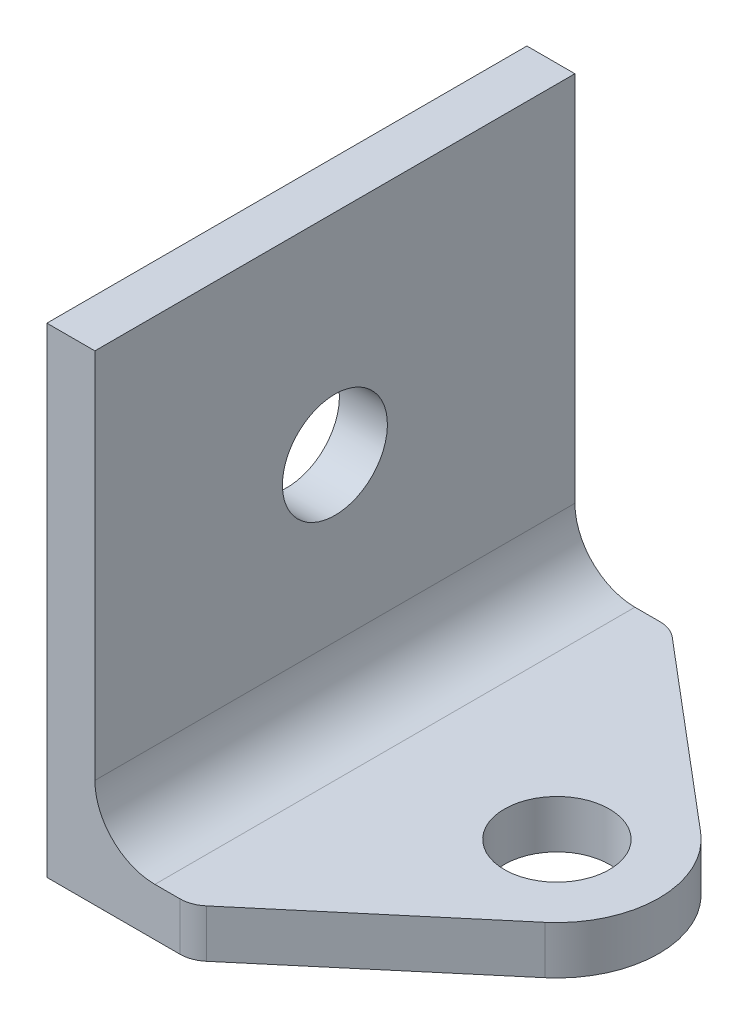
ISO-10303-21;
HEADER;
FILE_DESCRIPTION(('STEP AP214'),'2;1');
FILE_NAME('part.step','',(''),(''),'','','');
FILE_SCHEMA(('AUTOMOTIVE_DESIGN { 1 0 10303 214 1 1 1 1 }'));
ENDSEC;
DATA;
#1=APPLICATION_CONTEXT('core data for automotive mechanical design processes');
#2=APPLICATION_PROTOCOL_DEFINITION('international standard','automotive_design',2000,#1);
#3=PRODUCT_CONTEXT('',#1,'mechanical');
#4=PRODUCT('Part','Part','',(#3));
#5=PRODUCT_RELATED_PRODUCT_CATEGORY('part','',(#4));
#6=PRODUCT_DEFINITION_FORMATION('','',#4);
#7=PRODUCT_DEFINITION_CONTEXT('part definition',#1,'design');
#8=PRODUCT_DEFINITION('design','',#6,#7);
#9=PRODUCT_DEFINITION_SHAPE('','',#8);
#10=(LENGTH_UNIT() NAMED_UNIT(*) SI_UNIT(.MILLI.,.METRE.));
#11=(NAMED_UNIT(*) PLANE_ANGLE_UNIT() SI_UNIT($,.RADIAN.));
#12=(NAMED_UNIT(*) SI_UNIT($,.STERADIAN.) SOLID_ANGLE_UNIT());
#13=UNCERTAINTY_MEASURE_WITH_UNIT(LENGTH_MEASURE(1.E-05),#10,'distance_accuracy_value','');
#14=(GEOMETRIC_REPRESENTATION_CONTEXT(3) GLOBAL_UNCERTAINTY_ASSIGNED_CONTEXT((#13)) GLOBAL_UNIT_ASSIGNED_CONTEXT((#10,
#11,#12)) REPRESENTATION_CONTEXT('',''));
#15=CARTESIAN_POINT('',(0.,0.,0.));
#16=DIRECTION('',(0.,0.,1.));
#17=DIRECTION('',(1.,0.,0.));
#18=AXIS2_PLACEMENT_3D('',#15,#16,#17);
#19=CARTESIAN_POINT('',(0.,80.,40.));
#20=DIRECTION('',(1.,0.,0.));
#21=DIRECTION('',(0.,1.,0.));
#22=AXIS2_PLACEMENT_3D('',#19,#20,#21);
#23=PLANE('',#22);
#24=CARTESIAN_POINT('',(0.,45.,0.));
#25=DIRECTION('',(1.,0.,0.));
#26=DIRECTION('',(0.,1.,0.));
#27=AXIS2_PLACEMENT_3D('',#24,#25,#26);
#28=CIRCLE('',#27,8.75);
#29=CARTESIAN_POINT('',(0.,53.75,0.));
#30=VERTEX_POINT('',#29);
#31=EDGE_CURVE('E169',#30,#30,#28,.T.);
#32=ORIENTED_EDGE('',*,*,#31,.T.);
#33=EDGE_LOOP('',(#32));
#34=FACE_BOUND('',#33,.T.);
#35=DIRECTION('',(0.,-1.,0.));
#36=VECTOR('',#35,1.);
#37=CARTESIAN_POINT('',(0.,80.,-40.));
#38=LINE('',#37,#36);
#39=CARTESIAN_POINT('',(0.,80.,-40.));
#40=VERTEX_POINT('',#39);
#41=CARTESIAN_POINT('',(0.,0.,-40.));
#42=VERTEX_POINT('',#41);
#43=EDGE_CURVE('E181',#40,#42,#38,.T.);
#44=ORIENTED_EDGE('',*,*,#43,.T.);
#45=DIRECTION('',(0.,0.,-1.));
#46=VECTOR('',#45,1.);
#47=CARTESIAN_POINT('',(0.,0.,40.));
#48=LINE('',#47,#46);
#49=CARTESIAN_POINT('',(0.,0.,40.));
#50=VERTEX_POINT('',#49);
#51=EDGE_CURVE('E238',#50,#42,#48,.T.);
#52=ORIENTED_EDGE('',*,*,#51,.F.);
#53=DIRECTION('',(0.,-1.,0.));
#54=VECTOR('',#53,1.);
#55=CARTESIAN_POINT('',(0.,80.,40.));
#56=LINE('',#55,#54);
#57=CARTESIAN_POINT('',(0.,80.,40.));
#58=VERTEX_POINT('',#57);
#59=EDGE_CURVE('E185',#58,#50,#56,.T.);
#60=ORIENTED_EDGE('',*,*,#59,.F.);
#61=DIRECTION('',(0.,0.,-1.));
#62=VECTOR('',#61,1.);
#63=CARTESIAN_POINT('',(0.,80.,40.));
#64=LINE('',#63,#62);
#65=EDGE_CURVE('E205',#58,#40,#64,.T.);
#66=ORIENTED_EDGE('',*,*,#65,.T.);
#67=EDGE_LOOP('',(#44,#52,#60,#66));
#68=FACE_BOUND('',#67,.T.);
#69=ADVANCED_FACE('F44',(#34,#68),#23,.F.);
#70=CARTESIAN_POINT('',(0.,0.,40.));
#71=DIRECTION('',(0.,1.,0.));
#72=DIRECTION('',(0.,0.,1.));
#73=AXIS2_PLACEMENT_3D('',#70,#71,#72);
#74=PLANE('',#73);
#75=CARTESIAN_POINT('',(45.,0.,0.));
#76=DIRECTION('',(0.,1.,0.));
#77=DIRECTION('',(-1.,0.,0.));
#78=AXIS2_PLACEMENT_3D('',#75,#76,#77);
#79=CIRCLE('',#78,8.75);
#80=CARTESIAN_POINT('',(36.25,0.,0.));
#81=VERTEX_POINT('',#80);
#82=EDGE_CURVE('E177',#81,#81,#79,.T.);
#83=ORIENTED_EDGE('',*,*,#82,.T.);
#84=EDGE_LOOP('',(#83));
#85=FACE_BOUND('',#84,.T.);
#86=DIRECTION('',(1.,0.,0.));
#87=VECTOR('',#86,1.);
#88=CARTESIAN_POINT('',(0.,0.,-40.));
#89=LINE('',#88,#87);
#90=CARTESIAN_POINT('',(22.1704474497446,0.,-40.));
#91=VERTEX_POINT('',#90);
#92=EDGE_CURVE('E209',#42,#91,#89,.T.);
#93=ORIENTED_EDGE('',*,*,#92,.T.);
#94=CARTESIAN_POINT('',(22.1704474497446,0.,-35.));
#95=DIRECTION('',(0.,1.,0.));
#96=DIRECTION('',(0.,0.,1.));
#97=AXIS2_PLACEMENT_3D('',#94,#95,#96);
#98=CIRCLE('',#97,5.);
#99=CARTESIAN_POINT('',(25.3974831256792,0.,-38.8191937298657));
#100=VERTEX_POINT('',#99);
#101=EDGE_CURVE('E134',#91,#100,#98,.F.);
#102=ORIENTED_EDGE('',*,*,#101,.T.);
#103=DIRECTION('',(0.763838745973133,0.,0.645407135186923));
#104=VECTOR('',#103,1.);
#105=CARTESIAN_POINT('',(24.0000000000001,0.,-40.));
#106=LINE('',#105,#104);
#107=CARTESIAN_POINT('',(55.9719212981777,0.,-12.9852586815433));
#108=VERTEX_POINT('',#107);
#109=EDGE_CURVE('E127',#100,#108,#106,.T.);
#110=ORIENTED_EDGE('',*,*,#109,.T.);
#111=CARTESIAN_POINT('',(45.,0.,0.));
#112=DIRECTION('',(0.,-1.,0.));
#113=DIRECTION('',(-1.,0.,0.));
#114=AXIS2_PLACEMENT_3D('',#111,#112,#113);
#115=CIRCLE('',#114,17.);
#116=CARTESIAN_POINT('',(55.9719212981777,0.,12.9852586815433));
#117=VERTEX_POINT('',#116);
#118=EDGE_CURVE('E132',#108,#117,#115,.T.);
#119=ORIENTED_EDGE('',*,*,#118,.T.);
#120=DIRECTION('',(-0.763838745973134,0.,0.645407135186923));
#121=VECTOR('',#120,1.);
#122=CARTESIAN_POINT('',(24.0000000000001,0.,40.));
#123=LINE('',#122,#121);
#124=CARTESIAN_POINT('',(25.3974831256792,0.,38.8191937298657));
#125=VERTEX_POINT('',#124);
#126=EDGE_CURVE('E151',#117,#125,#123,.T.);
#127=ORIENTED_EDGE('',*,*,#126,.T.);
#128=CARTESIAN_POINT('',(22.1704474497446,0.,35.));
#129=DIRECTION('',(0.,1.,0.));
#130=DIRECTION('',(0.,0.,1.));
#131=AXIS2_PLACEMENT_3D('',#128,#129,#130);
#132=CIRCLE('',#131,5.);
#133=CARTESIAN_POINT('',(22.1704474497446,0.,40.));
#134=VERTEX_POINT('',#133);
#135=EDGE_CURVE('E60',#125,#134,#132,.F.);
#136=ORIENTED_EDGE('',*,*,#135,.T.);
#137=DIRECTION('',(1.,0.,0.));
#138=VECTOR('',#137,1.);
#139=CARTESIAN_POINT('',(0.,0.,40.));
#140=LINE('',#139,#138);
#141=EDGE_CURVE('E189',#50,#134,#140,.T.);
#142=ORIENTED_EDGE('',*,*,#141,.F.);
#143=ORIENTED_EDGE('',*,*,#51,.T.);
#144=EDGE_LOOP('',(#93,#102,#110,#119,#127,#136,#142,#143));
#145=FACE_BOUND('',#144,.T.);
#146=ADVANCED_FACE('F130',(#85,#145),#74,.F.);
#147=CARTESIAN_POINT('',(80.,8.,40.));
#148=DIRECTION('',(0.,-1.,0.));
#149=DIRECTION('',(1.,0.,0.));
#150=AXIS2_PLACEMENT_3D('',#147,#148,#149);
#151=PLANE('',#150);
#152=CARTESIAN_POINT('',(45.,8.,0.));
#153=DIRECTION('',(0.,1.,0.));
#154=DIRECTION('',(-1.,0.,0.));
#155=AXIS2_PLACEMENT_3D('',#152,#153,#154);
#156=CIRCLE('',#155,8.75);
#157=CARTESIAN_POINT('',(36.25,7.99999999999999,0.));
#158=VERTEX_POINT('',#157);
#159=EDGE_CURVE('E173',#158,#158,#156,.T.);
#160=ORIENTED_EDGE('',*,*,#159,.F.);
#161=EDGE_LOOP('',(#160));
#162=FACE_BOUND('',#161,.T.);
#163=DIRECTION('',(0.763838745973133,0.,0.645407135186923));
#164=VECTOR('',#163,1.);
#165=CARTESIAN_POINT('',(24.0000000000001,7.99999999999999,-40.));
#166=LINE('',#165,#164);
#167=CARTESIAN_POINT('',(25.3974831256792,7.99999999999999,-38.8191937298657));
#168=VERTEX_POINT('',#167);
#169=CARTESIAN_POINT('',(55.9719212981777,8.,-12.9852586815433));
#170=VERTEX_POINT('',#169);
#171=EDGE_CURVE('E145',#168,#170,#166,.T.);
#172=ORIENTED_EDGE('',*,*,#171,.F.);
#173=CARTESIAN_POINT('',(22.1704474497446,7.99999999999999,-35.));
#174=DIRECTION('',(0.,-1.,0.));
#175=DIRECTION('',(1.,0.,0.));
#176=AXIS2_PLACEMENT_3D('',#173,#174,#175);
#177=CIRCLE('',#176,5.);
#178=CARTESIAN_POINT('',(22.1704474497446,7.99999999999999,-40.));
#179=VERTEX_POINT('',#178);
#180=EDGE_CURVE('E248',#168,#179,#177,.F.);
#181=ORIENTED_EDGE('',*,*,#180,.T.);
#182=DIRECTION('',(-1.,0.,0.));
#183=VECTOR('',#182,1.);
#184=CARTESIAN_POINT('',(80.,8.,-40.));
#185=LINE('',#184,#183);
#186=CARTESIAN_POINT('',(18.0000000000001,7.99999999999999,-40.));
#187=VERTEX_POINT('',#186);
#188=EDGE_CURVE('E212',#179,#187,#185,.T.);
#189=ORIENTED_EDGE('',*,*,#188,.T.);
#190=DIRECTION('',(0.,0.,-1.));
#191=VECTOR('',#190,1.);
#192=CARTESIAN_POINT('',(18.0000000000001,7.99999999999999,40.));
#193=LINE('',#192,#191);
#194=CARTESIAN_POINT('',(18.0000000000001,7.99999999999999,40.));
#195=VERTEX_POINT('',#194);
#196=EDGE_CURVE('E234',#195,#187,#193,.T.);
#197=ORIENTED_EDGE('',*,*,#196,.F.);
#198=DIRECTION('',(-1.,0.,0.));
#199=VECTOR('',#198,1.);
#200=CARTESIAN_POINT('',(80.,8.,40.));
#201=LINE('',#200,#199);
#202=CARTESIAN_POINT('',(22.1704474497446,7.99999999999999,40.));
#203=VERTEX_POINT('',#202);
#204=EDGE_CURVE('E193',#203,#195,#201,.T.);
#205=ORIENTED_EDGE('',*,*,#204,.F.);
#206=CARTESIAN_POINT('',(22.1704474497446,7.99999999999999,35.));
#207=DIRECTION('',(0.,-1.,0.));
#208=DIRECTION('',(1.,0.,0.));
#209=AXIS2_PLACEMENT_3D('',#206,#207,#208);
#210=CIRCLE('',#209,5.);
#211=CARTESIAN_POINT('',(25.3974831256792,7.99999999999999,38.8191937298657));
#212=VERTEX_POINT('',#211);
#213=EDGE_CURVE('E245',#203,#212,#210,.F.);
#214=ORIENTED_EDGE('',*,*,#213,.T.);
#215=DIRECTION('',(-0.763838745973134,0.,0.645407135186923));
#216=VECTOR('',#215,1.);
#217=CARTESIAN_POINT('',(24.0000000000001,7.99999999999999,40.));
#218=LINE('',#217,#216);
#219=CARTESIAN_POINT('',(55.9719212981777,8.,12.9852586815433));
#220=VERTEX_POINT('',#219);
#221=EDGE_CURVE('E139',#220,#212,#218,.T.);
#222=ORIENTED_EDGE('',*,*,#221,.F.);
#223=CARTESIAN_POINT('',(45.,8.,0.));
#224=DIRECTION('',(0.,-1.,0.));
#225=DIRECTION('',(-1.,0.,0.));
#226=AXIS2_PLACEMENT_3D('',#223,#224,#225);
#227=CIRCLE('',#226,17.);
#228=EDGE_CURVE('E161',#170,#220,#227,.T.);
#229=ORIENTED_EDGE('',*,*,#228,.F.);
#230=EDGE_LOOP('',(#172,#181,#189,#197,#205,#214,#222,#229));
#231=FACE_BOUND('',#230,.T.);
#232=ADVANCED_FACE('F266',(#162,#231),#151,.F.);
#233=CARTESIAN_POINT('',(18.,18.,40.));
#234=DIRECTION('',(0.,0.,-1.));
#235=DIRECTION('',(-1.,0.,0.));
#236=AXIS2_PLACEMENT_3D('',#233,#234,#235);
#237=CYLINDRICAL_SURFACE('',#236,10.);
#238=CARTESIAN_POINT('',(18.,18.,-40.));
#239=DIRECTION('',(0.,0.,-1.));
#240=DIRECTION('',(-1.,0.,0.));
#241=AXIS2_PLACEMENT_3D('',#238,#239,#240);
#242=CIRCLE('',#241,10.);
#243=CARTESIAN_POINT('',(8.,18.,-40.));
#244=VERTEX_POINT('',#243);
#245=EDGE_CURVE('E215',#187,#244,#242,.T.);
#246=ORIENTED_EDGE('',*,*,#245,.T.);
#247=DIRECTION('',(0.,0.,-1.));
#248=VECTOR('',#247,1.);
#249=CARTESIAN_POINT('',(8.,18.,40.));
#250=LINE('',#249,#248);
#251=CARTESIAN_POINT('',(8.,18.,40.));
#252=VERTEX_POINT('',#251);
#253=EDGE_CURVE('E230',#252,#244,#250,.T.);
#254=ORIENTED_EDGE('',*,*,#253,.F.);
#255=CARTESIAN_POINT('',(18.,18.,40.));
#256=DIRECTION('',(0.,0.,-1.));
#257=DIRECTION('',(-1.,0.,0.));
#258=AXIS2_PLACEMENT_3D('',#255,#256,#257);
#259=CIRCLE('',#258,10.);
#260=EDGE_CURVE('E196',#195,#252,#259,.T.);
#261=ORIENTED_EDGE('',*,*,#260,.F.);
#262=ORIENTED_EDGE('',*,*,#196,.T.);
#263=EDGE_LOOP('',(#246,#254,#261,#262));
#264=FACE_BOUND('',#263,.T.);
#265=ADVANCED_FACE('F273',(#264),#237,.F.);
#266=CARTESIAN_POINT('',(7.99999999999999,18.0000000000001,40.));
#267=DIRECTION('',(-1.,0.,0.));
#268=DIRECTION('',(0.,-1.,0.));
#269=AXIS2_PLACEMENT_3D('',#266,#267,#268);
#270=PLANE('',#269);
#271=CARTESIAN_POINT('',(8.,45.,0.));
#272=DIRECTION('',(1.,0.,0.));
#273=DIRECTION('',(0.,1.,0.));
#274=AXIS2_PLACEMENT_3D('',#271,#272,#273);
#275=CIRCLE('',#274,8.75);
#276=CARTESIAN_POINT('',(8.,53.75,0.));
#277=VERTEX_POINT('',#276);
#278=EDGE_CURVE('E167',#277,#277,#275,.T.);
#279=ORIENTED_EDGE('',*,*,#278,.F.);
#280=EDGE_LOOP('',(#279));
#281=FACE_BOUND('',#280,.T.);
#282=DIRECTION('',(0.,1.,0.));
#283=VECTOR('',#282,1.);
#284=CARTESIAN_POINT('',(7.99999999999999,18.0000000000001,-40.));
#285=LINE('',#284,#283);
#286=CARTESIAN_POINT('',(8.,80.,-40.));
#287=VERTEX_POINT('',#286);
#288=EDGE_CURVE('E218',#244,#287,#285,.T.);
#289=ORIENTED_EDGE('',*,*,#288,.T.);
#290=DIRECTION('',(0.,0.,-1.));
#291=VECTOR('',#290,1.);
#292=CARTESIAN_POINT('',(8.,80.,40.));
#293=LINE('',#292,#291);
#294=CARTESIAN_POINT('',(8.,80.,40.));
#295=VERTEX_POINT('',#294);
#296=EDGE_CURVE('E226',#295,#287,#293,.T.);
#297=ORIENTED_EDGE('',*,*,#296,.F.);
#298=DIRECTION('',(0.,1.,0.));
#299=VECTOR('',#298,1.);
#300=CARTESIAN_POINT('',(7.99999999999999,18.0000000000001,40.));
#301=LINE('',#300,#299);
#302=EDGE_CURVE('E199',#252,#295,#301,.T.);
#303=ORIENTED_EDGE('',*,*,#302,.F.);
#304=ORIENTED_EDGE('',*,*,#253,.T.);
#305=EDGE_LOOP('',(#289,#297,#303,#304));
#306=FACE_BOUND('',#305,.T.);
#307=ADVANCED_FACE('F279',(#281,#306),#270,.F.);
#308=CARTESIAN_POINT('',(8.,80.,40.));
#309=DIRECTION('',(0.,-1.,0.));
#310=DIRECTION('',(0.,0.,-1.));
#311=AXIS2_PLACEMENT_3D('',#308,#309,#310);
#312=PLANE('',#311);
#313=DIRECTION('',(-1.,0.,0.));
#314=VECTOR('',#313,1.);
#315=CARTESIAN_POINT('',(8.,80.,-40.));
#316=LINE('',#315,#314);
#317=EDGE_CURVE('E190',#287,#40,#316,.T.);
#318=ORIENTED_EDGE('',*,*,#317,.T.);
#319=ORIENTED_EDGE('',*,*,#65,.F.);
#320=DIRECTION('',(-1.,0.,0.));
#321=VECTOR('',#320,1.);
#322=CARTESIAN_POINT('',(8.,80.,40.));
#323=LINE('',#322,#321);
#324=EDGE_CURVE('E202',#295,#58,#323,.T.);
#325=ORIENTED_EDGE('',*,*,#324,.F.);
#326=ORIENTED_EDGE('',*,*,#296,.T.);
#327=EDGE_LOOP('',(#318,#319,#325,#326));
#328=FACE_BOUND('',#327,.T.);
#329=ADVANCED_FACE('F283',(#328),#312,.F.);
#330=CARTESIAN_POINT('',(18.,18.,40.));
#331=DIRECTION('',(0.,0.,-1.));
#332=DIRECTION('',(-1.,0.,0.));
#333=AXIS2_PLACEMENT_3D('',#330,#331,#332);
#334=PLANE('',#333);
#335=ORIENTED_EDGE('',*,*,#141,.T.);
#336=DIRECTION('',(0.,1.,0.));
#337=VECTOR('',#336,1.);
#338=CARTESIAN_POINT('',(22.1704474497446,18.,40.));
#339=LINE('',#338,#337);
#340=EDGE_CURVE('E53',#134,#203,#339,.T.);
#341=ORIENTED_EDGE('',*,*,#340,.T.);
#342=ORIENTED_EDGE('',*,*,#204,.T.);
#343=ORIENTED_EDGE('',*,*,#260,.T.);
#344=ORIENTED_EDGE('',*,*,#302,.T.);
#345=ORIENTED_EDGE('',*,*,#324,.T.);
#346=ORIENTED_EDGE('',*,*,#59,.T.);
#347=EDGE_LOOP('',(#335,#341,#342,#343,#344,#345,#346));
#348=FACE_BOUND('',#347,.T.);
#349=ADVANCED_FACE('F262',(#348),#334,.F.);
#350=CARTESIAN_POINT('',(18.,18.,-40.));
#351=DIRECTION('',(0.,0.,-1.));
#352=DIRECTION('',(-1.,0.,0.));
#353=AXIS2_PLACEMENT_3D('',#350,#351,#352);
#354=PLANE('',#353);
#355=ORIENTED_EDGE('',*,*,#188,.F.);
#356=DIRECTION('',(0.,1.,0.));
#357=VECTOR('',#356,1.);
#358=CARTESIAN_POINT('',(22.1704474497446,0.,-40.));
#359=LINE('',#358,#357);
#360=EDGE_CURVE('E251',#179,#91,#359,.F.);
#361=ORIENTED_EDGE('',*,*,#360,.T.);
#362=ORIENTED_EDGE('',*,*,#92,.F.);
#363=ORIENTED_EDGE('',*,*,#43,.F.);
#364=ORIENTED_EDGE('',*,*,#317,.F.);
#365=ORIENTED_EDGE('',*,*,#288,.F.);
#366=ORIENTED_EDGE('',*,*,#245,.F.);
#367=EDGE_LOOP('',(#355,#361,#362,#363,#364,#365,#366));
#368=FACE_BOUND('',#367,.T.);
#369=ADVANCED_FACE('F317',(#368),#354,.T.);
#370=CARTESIAN_POINT('',(45.,0.,0.));
#371=DIRECTION('',(0.,1.,0.));
#372=DIRECTION('',(-1.,0.,0.));
#373=AXIS2_PLACEMENT_3D('',#370,#371,#372);
#374=CYLINDRICAL_SURFACE('',#373,8.75);
#375=ORIENTED_EDGE('',*,*,#82,.F.);
#376=EDGE_LOOP('',(#375));
#377=FACE_BOUND('',#376,.T.);
#378=ORIENTED_EDGE('',*,*,#159,.T.);
#379=EDGE_LOOP('',(#378));
#380=FACE_BOUND('',#379,.T.);
#381=ADVANCED_FACE('F320',(#377,#380),#374,.F.);
#382=CARTESIAN_POINT('',(0.,45.,0.));
#383=DIRECTION('',(1.,0.,0.));
#384=DIRECTION('',(0.,1.,0.));
#385=AXIS2_PLACEMENT_3D('',#382,#383,#384);
#386=CYLINDRICAL_SURFACE('',#385,8.75);
#387=ORIENTED_EDGE('',*,*,#31,.F.);
#388=EDGE_LOOP('',(#387));
#389=FACE_BOUND('',#388,.T.);
#390=ORIENTED_EDGE('',*,*,#278,.T.);
#391=EDGE_LOOP('',(#390));
#392=FACE_BOUND('',#391,.T.);
#393=ADVANCED_FACE('F324',(#389,#392),#386,.F.);
#394=CARTESIAN_POINT('',(24.0000000000001,0.,40.));
#395=DIRECTION('',(-0.645407135186923,0.,-0.763838745973134));
#396=DIRECTION('',(-0.763838745973134,0.,0.645407135186923));
#397=AXIS2_PLACEMENT_3D('',#394,#395,#396);
#398=PLANE('',#397);
#399=ORIENTED_EDGE('',*,*,#221,.T.);
#400=DIRECTION('',(0.,1.,0.));
#401=VECTOR('',#400,1.);
#402=CARTESIAN_POINT('',(25.3974831256792,0.,38.8191937298657));
#403=LINE('',#402,#401);
#404=EDGE_CURVE('E11',#212,#125,#403,.F.);
#405=ORIENTED_EDGE('',*,*,#404,.T.);
#406=ORIENTED_EDGE('',*,*,#126,.F.);
#407=DIRECTION('',(0.,1.,0.));
#408=VECTOR('',#407,1.);
#409=CARTESIAN_POINT('',(55.9719212981777,0.,12.9852586815433));
#410=LINE('',#409,#408);
#411=EDGE_CURVE('E150',#117,#220,#410,.T.);
#412=ORIENTED_EDGE('',*,*,#411,.T.);
#413=EDGE_LOOP('',(#399,#405,#406,#412));
#414=FACE_BOUND('',#413,.T.);
#415=ADVANCED_FACE('F292',(#414),#398,.F.);
#416=CARTESIAN_POINT('',(45.,0.,0.));
#417=DIRECTION('',(0.,1.,0.));
#418=DIRECTION('',(-1.,0.,0.));
#419=AXIS2_PLACEMENT_3D('',#416,#417,#418);
#420=CYLINDRICAL_SURFACE('',#419,17.);
#421=ORIENTED_EDGE('',*,*,#228,.T.);
#422=ORIENTED_EDGE('',*,*,#411,.F.);
#423=ORIENTED_EDGE('',*,*,#118,.F.);
#424=DIRECTION('',(0.,1.,0.));
#425=VECTOR('',#424,1.);
#426=CARTESIAN_POINT('',(55.9719212981777,0.,-12.9852586815433));
#427=LINE('',#426,#425);
#428=EDGE_CURVE('E142',#108,#170,#427,.T.);
#429=ORIENTED_EDGE('',*,*,#428,.T.);
#430=EDGE_LOOP('',(#421,#422,#423,#429));
#431=FACE_BOUND('',#430,.T.);
#432=ADVANCED_FACE('F153',(#431),#420,.T.);
#433=CARTESIAN_POINT('',(24.0000000000001,0.,-40.));
#434=DIRECTION('',(-0.645407135186923,0.,0.763838745973133));
#435=DIRECTION('',(0.763838745973133,0.,0.645407135186923));
#436=AXIS2_PLACEMENT_3D('',#433,#434,#435);
#437=PLANE('',#436);
#438=ORIENTED_EDGE('',*,*,#109,.F.);
#439=DIRECTION('',(0.,1.,0.));
#440=VECTOR('',#439,1.);
#441=CARTESIAN_POINT('',(25.3974831256792,7.99999999999999,-38.8191937298657));
#442=LINE('',#441,#440);
#443=EDGE_CURVE('E242',#100,#168,#442,.T.);
#444=ORIENTED_EDGE('',*,*,#443,.T.);
#445=ORIENTED_EDGE('',*,*,#171,.T.);
#446=ORIENTED_EDGE('',*,*,#428,.F.);
#447=EDGE_LOOP('',(#438,#444,#445,#446));
#448=FACE_BOUND('',#447,.T.);
#449=ADVANCED_FACE('F143',(#448),#437,.F.);
#450=CARTESIAN_POINT('',(22.1704474497446,0.,-35.));
#451=DIRECTION('',(0.,-1.,0.));
#452=DIRECTION('',(1.,0.,0.));
#453=AXIS2_PLACEMENT_3D('',#450,#451,#452);
#454=CYLINDRICAL_SURFACE('',#453,5.);
#455=ORIENTED_EDGE('',*,*,#101,.F.);
#456=ORIENTED_EDGE('',*,*,#360,.F.);
#457=ORIENTED_EDGE('',*,*,#180,.F.);
#458=ORIENTED_EDGE('',*,*,#443,.F.);
#459=EDGE_LOOP('',(#455,#456,#457,#458));
#460=FACE_BOUND('',#459,.T.);
#461=ADVANCED_FACE('F291',(#460),#454,.T.);
#462=CARTESIAN_POINT('',(22.1704474497446,18.,35.));
#463=DIRECTION('',(0.,1.,0.));
#464=DIRECTION('',(-1.,0.,0.));
#465=AXIS2_PLACEMENT_3D('',#462,#463,#464);
#466=CYLINDRICAL_SURFACE('',#465,5.);
#467=ORIENTED_EDGE('',*,*,#135,.F.);
#468=ORIENTED_EDGE('',*,*,#404,.F.);
#469=ORIENTED_EDGE('',*,*,#213,.F.);
#470=ORIENTED_EDGE('',*,*,#340,.F.);
#471=EDGE_LOOP('',(#467,#468,#469,#470));
#472=FACE_BOUND('',#471,.T.);
#473=ADVANCED_FACE('F46',(#472),#466,.T.);
#474=CLOSED_SHELL('',(#69,#146,#232,#265,#307,#329,#349,#369,#381,#393,#415,#432,#449,#461,#473));
#475=MANIFOLD_SOLID_BREP('B2',#474);
#476=ADVANCED_BREP_SHAPE_REPRESENTATION('',(#18,#475),#14);
#477=SHAPE_DEFINITION_REPRESENTATION(#9,#476);
ENDSEC;
END-ISO-10303-21;
